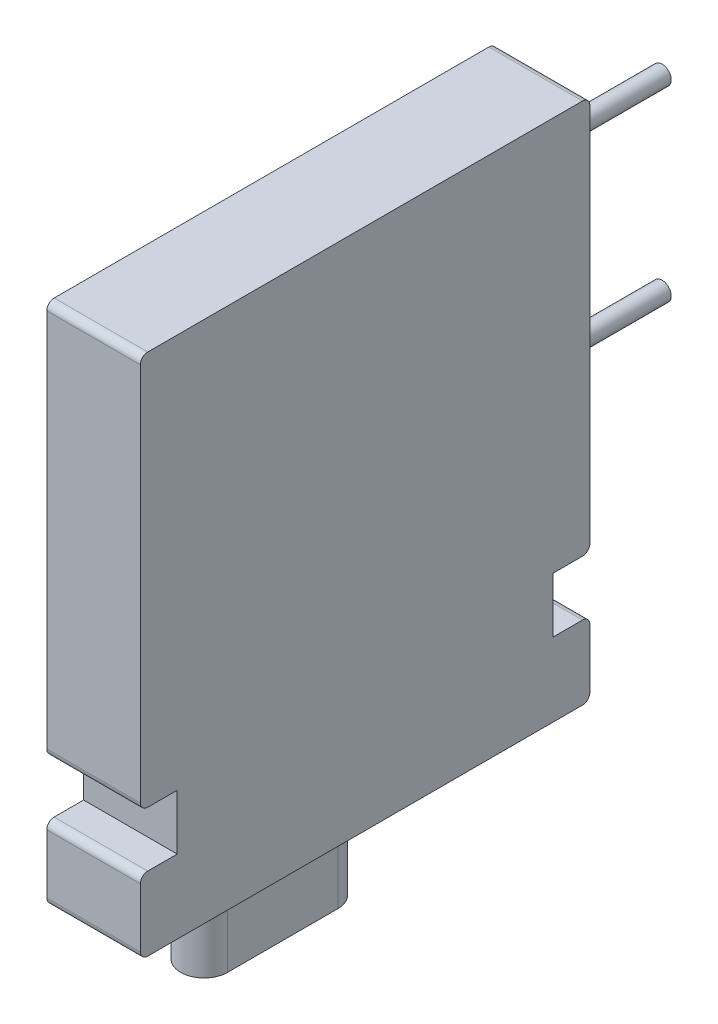
ISO-10303-21;
HEADER;
FILE_DESCRIPTION(('STEP AP214'),'2;1');
FILE_NAME('part.step','',(''),(''),'','','');
FILE_SCHEMA(('AUTOMOTIVE_DESIGN { 1 0 10303 214 1 1 1 1 }'));
ENDSEC;
DATA;
#1=APPLICATION_CONTEXT('core data for automotive mechanical design processes');
#2=APPLICATION_PROTOCOL_DEFINITION('international standard','automotive_design',2000,#1);
#3=PRODUCT_CONTEXT('',#1,'mechanical');
#4=PRODUCT('Part','Part','',(#3));
#5=PRODUCT_RELATED_PRODUCT_CATEGORY('part','',(#4));
#6=PRODUCT_DEFINITION_FORMATION('','',#4);
#7=PRODUCT_DEFINITION_CONTEXT('part definition',#1,'design');
#8=PRODUCT_DEFINITION('design','',#6,#7);
#9=PRODUCT_DEFINITION_SHAPE('','',#8);
#10=(LENGTH_UNIT() NAMED_UNIT(*) SI_UNIT(.MILLI.,.METRE.));
#11=(NAMED_UNIT(*) PLANE_ANGLE_UNIT() SI_UNIT($,.RADIAN.));
#12=(NAMED_UNIT(*) SI_UNIT($,.STERADIAN.) SOLID_ANGLE_UNIT());
#13=UNCERTAINTY_MEASURE_WITH_UNIT(LENGTH_MEASURE(1.E-05),#10,'distance_accuracy_value','');
#14=(GEOMETRIC_REPRESENTATION_CONTEXT(3) GLOBAL_UNCERTAINTY_ASSIGNED_CONTEXT((#13)) GLOBAL_UNIT_ASSIGNED_CONTEXT((#10,
#11,#12)) REPRESENTATION_CONTEXT('',''));
#15=CARTESIAN_POINT('',(0.,0.,0.));
#16=DIRECTION('',(0.,0.,1.));
#17=DIRECTION('',(1.,0.,0.));
#18=AXIS2_PLACEMENT_3D('',#15,#16,#17);
#19=CARTESIAN_POINT('',(0.,0.,0.));
#20=DIRECTION('',(0.,0.,-1.));
#21=DIRECTION('',(-1.,0.,0.));
#22=AXIS2_PLACEMENT_3D('',#19,#20,#21);
#23=PLANE('',#22);
#24=DIRECTION('',(0.,1.,0.));
#25=VECTOR('',#24,1.);
#26=CARTESIAN_POINT('',(2.54,0.,0.));
#27=LINE('',#26,#25);
#28=CARTESIAN_POINT('',(2.54,3.7,0.));
#29=VERTEX_POINT('',#28);
#30=CARTESIAN_POINT('',(2.54,14.,0.));
#31=VERTEX_POINT('',#30);
#32=EDGE_CURVE('E368',#29,#31,#27,.T.);
#33=ORIENTED_EDGE('',*,*,#32,.F.);
#34=DIRECTION('',(-1.,0.,0.));
#35=VECTOR('',#34,1.);
#36=CARTESIAN_POINT('',(0.,3.7,0.));
#37=LINE('',#36,#35);
#38=CARTESIAN_POINT('',(0.,3.7,0.));
#39=VERTEX_POINT('',#38);
#40=EDGE_CURVE('E382',#29,#39,#37,.T.);
#41=ORIENTED_EDGE('',*,*,#40,.T.);
#42=DIRECTION('',(0.,-1.,0.));
#43=VECTOR('',#42,1.);
#44=CARTESIAN_POINT('',(0.,0.,0.));
#45=LINE('',#44,#43);
#46=CARTESIAN_POINT('',(0.,14.,0.));
#47=VERTEX_POINT('',#46);
#48=EDGE_CURVE('E365',#47,#39,#45,.T.);
#49=ORIENTED_EDGE('',*,*,#48,.F.);
#50=DIRECTION('',(-1.,0.,0.));
#51=VECTOR('',#50,1.);
#52=CARTESIAN_POINT('',(2.54,14.,0.));
#53=LINE('',#52,#51);
#54=EDGE_CURVE('E380',#47,#31,#53,.F.);
#55=ORIENTED_EDGE('',*,*,#54,.T.);
#56=EDGE_LOOP('',(#33,#41,#49,#55));
#57=FACE_BOUND('',#56,.T.);
#58=CARTESIAN_POINT('',(1.5,7.62,0.));
#59=DIRECTION('',(0.,0.,-1.));
#60=DIRECTION('',(-1.,0.,0.));
#61=AXIS2_PLACEMENT_3D('',#58,#59,#60);
#62=CIRCLE('',#61,0.25);
#63=CARTESIAN_POINT('',(1.25,7.62,0.));
#64=VERTEX_POINT('',#63);
#65=EDGE_CURVE('E341',#64,#64,#62,.T.);
#66=ORIENTED_EDGE('',*,*,#65,.F.);
#67=EDGE_LOOP('',(#66));
#68=FACE_BOUND('',#67,.T.);
#69=CARTESIAN_POINT('',(1.5,12.7,0.));
#70=DIRECTION('',(0.,0.,-1.));
#71=DIRECTION('',(-1.,0.,0.));
#72=AXIS2_PLACEMENT_3D('',#69,#70,#71);
#73=CIRCLE('',#72,0.25);
#74=CARTESIAN_POINT('',(1.25,12.7,0.));
#75=VERTEX_POINT('',#74);
#76=EDGE_CURVE('E345',#75,#75,#73,.T.);
#77=ORIENTED_EDGE('',*,*,#76,.F.);
#78=EDGE_LOOP('',(#77));
#79=FACE_BOUND('',#78,.T.);
#80=ADVANCED_FACE('F37',(#57,#68,#79),#23,.T.);
#81=CARTESIAN_POINT('',(0.,0.,12.2));
#82=DIRECTION('',(0.,0.,-1.));
#83=DIRECTION('',(-1.,0.,0.));
#84=AXIS2_PLACEMENT_3D('',#81,#82,#83);
#85=PLANE('',#84);
#86=DIRECTION('',(0.,-1.,0.));
#87=VECTOR('',#86,1.);
#88=CARTESIAN_POINT('',(0.,0.,12.2));
#89=LINE('',#88,#87);
#90=CARTESIAN_POINT('',(0.,14.,12.2));
#91=VERTEX_POINT('',#90);
#92=CARTESIAN_POINT('',(0.,3.7,12.2));
#93=VERTEX_POINT('',#92);
#94=EDGE_CURVE('E354',#91,#93,#89,.T.);
#95=ORIENTED_EDGE('',*,*,#94,.T.);
#96=DIRECTION('',(-1.,0.,0.));
#97=VECTOR('',#96,1.);
#98=CARTESIAN_POINT('',(0.,3.7,12.2));
#99=LINE('',#98,#97);
#100=CARTESIAN_POINT('',(2.54,3.7,12.2));
#101=VERTEX_POINT('',#100);
#102=EDGE_CURVE('E429',#93,#101,#99,.F.);
#103=ORIENTED_EDGE('',*,*,#102,.T.);
#104=DIRECTION('',(0.,1.,0.));
#105=VECTOR('',#104,1.);
#106=CARTESIAN_POINT('',(2.54,0.,12.2));
#107=LINE('',#106,#105);
#108=CARTESIAN_POINT('',(2.54,14.,12.2));
#109=VERTEX_POINT('',#108);
#110=EDGE_CURVE('E357',#101,#109,#107,.T.);
#111=ORIENTED_EDGE('',*,*,#110,.T.);
#112=DIRECTION('',(-1.,0.,0.));
#113=VECTOR('',#112,1.);
#114=CARTESIAN_POINT('',(0.,14.,12.2));
#115=LINE('',#114,#113);
#116=EDGE_CURVE('E426',#109,#91,#115,.T.);
#117=ORIENTED_EDGE('',*,*,#116,.T.);
#118=EDGE_LOOP('',(#95,#103,#111,#117));
#119=FACE_BOUND('',#118,.T.);
#120=ADVANCED_FACE('F486',(#119),#85,.F.);
#121=CARTESIAN_POINT('',(0.,0.,12.2));
#122=DIRECTION('',(0.,1.,0.));
#123=DIRECTION('',(0.,0.,1.));
#124=AXIS2_PLACEMENT_3D('',#121,#122,#123);
#125=PLANE('',#124);
#126=DIRECTION('',(-1.,0.,0.));
#127=VECTOR('',#126,1.);
#128=CARTESIAN_POINT('',(0.269999999999998,0.,3.5));
#129=LINE('',#128,#127);
#130=CARTESIAN_POINT('',(2.27,0.,3.5));
#131=VERTEX_POINT('',#130);
#132=CARTESIAN_POINT('',(0.269999999999998,0.,3.5));
#133=VERTEX_POINT('',#132);
#134=EDGE_CURVE('E292',#131,#133,#129,.T.);
#135=ORIENTED_EDGE('',*,*,#134,.F.);
#136=DIRECTION('',(0.,0.,1.));
#137=VECTOR('',#136,1.);
#138=CARTESIAN_POINT('',(2.27,0.,3.5));
#139=LINE('',#138,#137);
#140=CARTESIAN_POINT('',(2.27,0.,1.5));
#141=VERTEX_POINT('',#140);
#142=EDGE_CURVE('E276',#141,#131,#139,.T.);
#143=ORIENTED_EDGE('',*,*,#142,.F.);
#144=DIRECTION('',(1.,0.,0.));
#145=VECTOR('',#144,1.);
#146=CARTESIAN_POINT('',(0.269999999999999,0.,1.5));
#147=LINE('',#146,#145);
#148=CARTESIAN_POINT('',(0.269999999999999,0.,1.5));
#149=VERTEX_POINT('',#148);
#150=EDGE_CURVE('E281',#149,#141,#147,.T.);
#151=ORIENTED_EDGE('',*,*,#150,.F.);
#152=DIRECTION('',(0.,0.,-1.));
#153=VECTOR('',#152,1.);
#154=CARTESIAN_POINT('',(0.269999999999998,0.,3.5));
#155=LINE('',#154,#153);
#156=EDGE_CURVE('E295',#133,#149,#155,.T.);
#157=ORIENTED_EDGE('',*,*,#156,.F.);
#158=EDGE_LOOP('',(#135,#143,#151,#157));
#159=FACE_BOUND('',#158,.T.);
#160=DIRECTION('',(0.,0.,-1.));
#161=VECTOR('',#160,1.);
#162=CARTESIAN_POINT('',(0.,0.,12.2));
#163=LINE('',#162,#161);
#164=CARTESIAN_POINT('',(0.,0.,12.));
#165=VERTEX_POINT('',#164);
#166=CARTESIAN_POINT('',(0.,0.,0.200000000000001));
#167=VERTEX_POINT('',#166);
#168=EDGE_CURVE('E377',#165,#167,#163,.T.);
#169=ORIENTED_EDGE('',*,*,#168,.T.);
#170=DIRECTION('',(1.,0.,0.));
#171=VECTOR('',#170,1.);
#172=CARTESIAN_POINT('',(2.54,0.,0.200000000000001));
#173=LINE('',#172,#171);
#174=CARTESIAN_POINT('',(2.54,0.,0.200000000000001));
#175=VERTEX_POINT('',#174);
#176=EDGE_CURVE('E11',#167,#175,#173,.T.);
#177=ORIENTED_EDGE('',*,*,#176,.T.);
#178=DIRECTION('',(0.,0.,-1.));
#179=VECTOR('',#178,1.);
#180=CARTESIAN_POINT('',(2.54,0.,12.2));
#181=LINE('',#180,#179);
#182=CARTESIAN_POINT('',(2.54,0.,12.));
#183=VERTEX_POINT('',#182);
#184=EDGE_CURVE('E374',#183,#175,#181,.T.);
#185=ORIENTED_EDGE('',*,*,#184,.F.);
#186=DIRECTION('',(1.,0.,0.));
#187=VECTOR('',#186,1.);
#188=CARTESIAN_POINT('',(0.,0.,12.));
#189=LINE('',#188,#187);
#190=EDGE_CURVE('E45',#183,#165,#189,.F.);
#191=ORIENTED_EDGE('',*,*,#190,.T.);
#192=EDGE_LOOP('',(#169,#177,#185,#191));
#193=FACE_BOUND('',#192,.T.);
#194=CARTESIAN_POINT('',(1.27,0.,9.2));
#195=DIRECTION('',(0.,-1.,0.));
#196=DIRECTION('',(0.,0.,-1.));
#197=AXIS2_PLACEMENT_3D('',#194,#195,#196);
#198=CIRCLE('',#197,0.635);
#199=CARTESIAN_POINT('',(1.905,0.,9.2));
#200=VERTEX_POINT('',#199);
#201=CARTESIAN_POINT('',(0.635,0.,9.2));
#202=VERTEX_POINT('',#201);
#203=EDGE_CURVE('E302',#200,#202,#198,.T.);
#204=ORIENTED_EDGE('',*,*,#203,.F.);
#205=DIRECTION('',(0.,0.,1.));
#206=VECTOR('',#205,1.);
#207=CARTESIAN_POINT('',(1.905,0.,9.2));
#208=LINE('',#207,#206);
#209=CARTESIAN_POINT('',(1.905,0.,6.2));
#210=VERTEX_POINT('',#209);
#211=EDGE_CURVE('E313',#210,#200,#208,.T.);
#212=ORIENTED_EDGE('',*,*,#211,.F.);
#213=CARTESIAN_POINT('',(1.27,0.,6.2));
#214=DIRECTION('',(0.,-1.,0.));
#215=DIRECTION('',(0.,0.,-1.));
#216=AXIS2_PLACEMENT_3D('',#213,#214,#215);
#217=CIRCLE('',#216,0.635);
#218=CARTESIAN_POINT('',(0.635,0.,6.2));
#219=VERTEX_POINT('',#218);
#220=EDGE_CURVE('E325',#219,#210,#217,.T.);
#221=ORIENTED_EDGE('',*,*,#220,.F.);
#222=DIRECTION('',(0.,0.,-1.));
#223=VECTOR('',#222,1.);
#224=CARTESIAN_POINT('',(0.635,0.,9.2));
#225=LINE('',#224,#223);
#226=EDGE_CURVE('E322',#202,#219,#225,.T.);
#227=ORIENTED_EDGE('',*,*,#226,.F.);
#228=EDGE_LOOP('',(#204,#212,#221,#227));
#229=FACE_BOUND('',#228,.T.);
#230=ADVANCED_FACE('F447',(#159,#193,#229),#125,.F.);
#231=CARTESIAN_POINT('',(0.,0.,12.2));
#232=DIRECTION('',(1.,0.,0.));
#233=DIRECTION('',(0.,0.,-1.));
#234=AXIS2_PLACEMENT_3D('',#231,#232,#233);
#235=PLANE('',#234);
#236=ORIENTED_EDGE('',*,*,#48,.T.);
#237=CARTESIAN_POINT('',(0.,3.7,0.2));
#238=DIRECTION('',(1.,0.,0.));
#239=DIRECTION('',(0.,0.,-1.));
#240=AXIS2_PLACEMENT_3D('',#237,#238,#239);
#241=CIRCLE('',#240,0.2);
#242=CARTESIAN_POINT('',(0.,3.5,0.2));
#243=VERTEX_POINT('',#242);
#244=EDGE_CURVE('E399',#39,#243,#241,.F.);
#245=ORIENTED_EDGE('',*,*,#244,.T.);
#246=DIRECTION('',(0.,0.,-1.));
#247=VECTOR('',#246,1.);
#248=CARTESIAN_POINT('',(0.,3.5,1.));
#249=LINE('',#248,#247);
#250=CARTESIAN_POINT('',(0.,3.5,1.));
#251=VERTEX_POINT('',#250);
#252=EDGE_CURVE('E247',#251,#243,#249,.T.);
#253=ORIENTED_EDGE('',*,*,#252,.F.);
#254=DIRECTION('',(0.,1.,0.));
#255=VECTOR('',#254,1.);
#256=CARTESIAN_POINT('',(0.,3.5,1.));
#257=LINE('',#256,#255);
#258=CARTESIAN_POINT('',(0.,2.,1.));
#259=VERTEX_POINT('',#258);
#260=EDGE_CURVE('E237',#259,#251,#257,.T.);
#261=ORIENTED_EDGE('',*,*,#260,.F.);
#262=DIRECTION('',(0.,0.,1.));
#263=VECTOR('',#262,1.);
#264=CARTESIAN_POINT('',(0.,2.,1.));
#265=LINE('',#264,#263);
#266=CARTESIAN_POINT('',(0.,2.,0.2));
#267=VERTEX_POINT('',#266);
#268=EDGE_CURVE('E222',#267,#259,#265,.T.);
#269=ORIENTED_EDGE('',*,*,#268,.F.);
#270=CARTESIAN_POINT('',(0.,1.8,0.2));
#271=DIRECTION('',(1.,0.,0.));
#272=DIRECTION('',(0.,0.,-1.));
#273=AXIS2_PLACEMENT_3D('',#270,#271,#272);
#274=CIRCLE('',#273,0.2);
#275=CARTESIAN_POINT('',(0.,1.8,0.));
#276=VERTEX_POINT('',#275);
#277=EDGE_CURVE('E397',#267,#276,#274,.F.);
#278=ORIENTED_EDGE('',*,*,#277,.T.);
#279=CARTESIAN_POINT('',(0.,0.2,0.));
#280=VERTEX_POINT('',#279);
#281=EDGE_CURVE('E351',#276,#280,#45,.T.);
#282=ORIENTED_EDGE('',*,*,#281,.T.);
#283=CARTESIAN_POINT('',(0.,0.2,0.200000000000001));
#284=DIRECTION('',(1.,0.,0.));
#285=DIRECTION('',(0.,0.,-1.));
#286=AXIS2_PLACEMENT_3D('',#283,#284,#285);
#287=CIRCLE('',#286,0.2);
#288=EDGE_CURVE('E387',#280,#167,#287,.F.);
#289=ORIENTED_EDGE('',*,*,#288,.T.);
#290=ORIENTED_EDGE('',*,*,#168,.F.);
#291=CARTESIAN_POINT('',(0.,0.2,12.));
#292=DIRECTION('',(1.,0.,0.));
#293=DIRECTION('',(0.,0.,-1.));
#294=AXIS2_PLACEMENT_3D('',#291,#292,#293);
#295=CIRCLE('',#294,0.2);
#296=CARTESIAN_POINT('',(0.,0.2,12.2));
#297=VERTEX_POINT('',#296);
#298=EDGE_CURVE('E385',#165,#297,#295,.F.);
#299=ORIENTED_EDGE('',*,*,#298,.T.);
#300=CARTESIAN_POINT('',(0.,1.8,12.2));
#301=VERTEX_POINT('',#300);
#302=EDGE_CURVE('E358',#301,#297,#89,.T.);
#303=ORIENTED_EDGE('',*,*,#302,.F.);
#304=CARTESIAN_POINT('',(0.,1.8,12.));
#305=DIRECTION('',(1.,0.,0.));
#306=DIRECTION('',(0.,0.,-1.));
#307=AXIS2_PLACEMENT_3D('',#304,#305,#306);
#308=CIRCLE('',#307,0.2);
#309=CARTESIAN_POINT('',(0.,2.,12.));
#310=VERTEX_POINT('',#309);
#311=EDGE_CURVE('E393',#301,#310,#308,.F.);
#312=ORIENTED_EDGE('',*,*,#311,.T.);
#313=DIRECTION('',(0.,0.,1.));
#314=VECTOR('',#313,1.);
#315=CARTESIAN_POINT('',(0.,2.,13.7974919074563));
#316=LINE('',#315,#314);
#317=CARTESIAN_POINT('',(0.,2.,11.2));
#318=VERTEX_POINT('',#317);
#319=EDGE_CURVE('E271',#318,#310,#316,.T.);
#320=ORIENTED_EDGE('',*,*,#319,.F.);
#321=DIRECTION('',(0.,-1.,0.));
#322=VECTOR('',#321,1.);
#323=CARTESIAN_POINT('',(0.,3.5,11.2));
#324=LINE('',#323,#322);
#325=CARTESIAN_POINT('',(0.,3.5,11.2));
#326=VERTEX_POINT('',#325);
#327=EDGE_CURVE('E231',#326,#318,#324,.T.);
#328=ORIENTED_EDGE('',*,*,#327,.F.);
#329=DIRECTION('',(0.,0.,-1.));
#330=VECTOR('',#329,1.);
#331=CARTESIAN_POINT('',(0.,3.5,13.7974919074563));
#332=LINE('',#331,#330);
#333=CARTESIAN_POINT('',(0.,3.5,12.));
#334=VERTEX_POINT('',#333);
#335=EDGE_CURVE('E258',#334,#326,#332,.T.);
#336=ORIENTED_EDGE('',*,*,#335,.F.);
#337=CARTESIAN_POINT('',(0.,3.7,12.));
#338=DIRECTION('',(1.,0.,0.));
#339=DIRECTION('',(0.,0.,-1.));
#340=AXIS2_PLACEMENT_3D('',#337,#338,#339);
#341=CIRCLE('',#340,0.2);
#342=EDGE_CURVE('E395',#334,#93,#341,.F.);
#343=ORIENTED_EDGE('',*,*,#342,.T.);
#344=ORIENTED_EDGE('',*,*,#94,.F.);
#345=CARTESIAN_POINT('',(0.,14.,12.));
#346=DIRECTION('',(1.,0.,0.));
#347=DIRECTION('',(0.,0.,-1.));
#348=AXIS2_PLACEMENT_3D('',#345,#346,#347);
#349=CIRCLE('',#348,0.2);
#350=CARTESIAN_POINT('',(0.,14.2,12.));
#351=VERTEX_POINT('',#350);
#352=EDGE_CURVE('E389',#91,#351,#349,.F.);
#353=ORIENTED_EDGE('',*,*,#352,.T.);
#354=DIRECTION('',(0.,0.,-1.));
#355=VECTOR('',#354,1.);
#356=CARTESIAN_POINT('',(0.,14.2,12.2));
#357=LINE('',#356,#355);
#358=CARTESIAN_POINT('',(0.,14.2,0.200000000000001));
#359=VERTEX_POINT('',#358);
#360=EDGE_CURVE('E362',#351,#359,#357,.T.);
#361=ORIENTED_EDGE('',*,*,#360,.T.);
#362=CARTESIAN_POINT('',(0.,14.,0.200000000000001));
#363=DIRECTION('',(1.,0.,0.));
#364=DIRECTION('',(0.,0.,-1.));
#365=AXIS2_PLACEMENT_3D('',#362,#363,#364);
#366=CIRCLE('',#365,0.2);
#367=EDGE_CURVE('E391',#359,#47,#366,.F.);
#368=ORIENTED_EDGE('',*,*,#367,.T.);
#369=EDGE_LOOP('',(#236,#245,#253,#261,#269,#278,#282,#289,#290,#299,#303,#312,#320,#328,#336,
#343,#344,#353,#361,#368));
#370=FACE_BOUND('',#369,.T.);
#371=ADVANCED_FACE('F245',(#370),#235,.F.);
#372=CARTESIAN_POINT('',(2.54,0.,12.2));
#373=DIRECTION('',(-1.,0.,0.));
#374=DIRECTION('',(0.,0.,1.));
#375=AXIS2_PLACEMENT_3D('',#372,#373,#374);
#376=PLANE('',#375);
#377=DIRECTION('',(0.,0.,1.));
#378=VECTOR('',#377,1.);
#379=CARTESIAN_POINT('',(2.54,3.5,1.));
#380=LINE('',#379,#378);
#381=CARTESIAN_POINT('',(2.54,3.5,0.2));
#382=VERTEX_POINT('',#381);
#383=CARTESIAN_POINT('',(2.54,3.5,1.));
#384=VERTEX_POINT('',#383);
#385=EDGE_CURVE('E241',#382,#384,#380,.T.);
#386=ORIENTED_EDGE('',*,*,#385,.F.);
#387=CARTESIAN_POINT('',(2.54,3.7,0.2));
#388=DIRECTION('',(-1.,0.,0.));
#389=DIRECTION('',(0.,0.,1.));
#390=AXIS2_PLACEMENT_3D('',#387,#388,#389);
#391=CIRCLE('',#390,0.2);
#392=EDGE_CURVE('E416',#382,#29,#391,.F.);
#393=ORIENTED_EDGE('',*,*,#392,.T.);
#394=ORIENTED_EDGE('',*,*,#32,.T.);
#395=CARTESIAN_POINT('',(2.54,14.,0.200000000000001));
#396=DIRECTION('',(-1.,0.,0.));
#397=DIRECTION('',(0.,0.,1.));
#398=AXIS2_PLACEMENT_3D('',#395,#396,#397);
#399=CIRCLE('',#398,0.2);
#400=CARTESIAN_POINT('',(2.54,14.2,0.200000000000001));
#401=VERTEX_POINT('',#400);
#402=EDGE_CURVE('E409',#31,#401,#399,.F.);
#403=ORIENTED_EDGE('',*,*,#402,.T.);
#404=DIRECTION('',(0.,0.,-1.));
#405=VECTOR('',#404,1.);
#406=CARTESIAN_POINT('',(2.54,14.2,12.2));
#407=LINE('',#406,#405);
#408=CARTESIAN_POINT('',(2.54,14.2,12.));
#409=VERTEX_POINT('',#408);
#410=EDGE_CURVE('E371',#409,#401,#407,.T.);
#411=ORIENTED_EDGE('',*,*,#410,.F.);
#412=CARTESIAN_POINT('',(2.54,14.,12.));
#413=DIRECTION('',(-1.,0.,0.));
#414=DIRECTION('',(0.,0.,1.));
#415=AXIS2_PLACEMENT_3D('',#412,#413,#414);
#416=CIRCLE('',#415,0.2);
#417=EDGE_CURVE('E407',#409,#109,#416,.F.);
#418=ORIENTED_EDGE('',*,*,#417,.T.);
#419=ORIENTED_EDGE('',*,*,#110,.F.);
#420=CARTESIAN_POINT('',(2.54,3.7,12.));
#421=DIRECTION('',(-1.,0.,0.));
#422=DIRECTION('',(0.,0.,1.));
#423=AXIS2_PLACEMENT_3D('',#420,#421,#422);
#424=CIRCLE('',#423,0.2);
#425=CARTESIAN_POINT('',(2.54,3.5,12.));
#426=VERTEX_POINT('',#425);
#427=EDGE_CURVE('E413',#101,#426,#424,.F.);
#428=ORIENTED_EDGE('',*,*,#427,.T.);
#429=DIRECTION('',(0.,0.,1.));
#430=VECTOR('',#429,1.);
#431=CARTESIAN_POINT('',(2.54,3.5,13.7974919074563));
#432=LINE('',#431,#430);
#433=CARTESIAN_POINT('',(2.54,3.5,11.2));
#434=VERTEX_POINT('',#433);
#435=EDGE_CURVE('E265',#434,#426,#432,.T.);
#436=ORIENTED_EDGE('',*,*,#435,.F.);
#437=DIRECTION('',(0.,1.,0.));
#438=VECTOR('',#437,1.);
#439=CARTESIAN_POINT('',(2.54,3.5,11.2));
#440=LINE('',#439,#438);
#441=CARTESIAN_POINT('',(2.54,2.,11.2));
#442=VERTEX_POINT('',#441);
#443=EDGE_CURVE('E262',#442,#434,#440,.T.);
#444=ORIENTED_EDGE('',*,*,#443,.F.);
#445=DIRECTION('',(0.,0.,-1.));
#446=VECTOR('',#445,1.);
#447=CARTESIAN_POINT('',(2.54,2.,13.7974919074563));
#448=LINE('',#447,#446);
#449=CARTESIAN_POINT('',(2.54,2.,12.));
#450=VERTEX_POINT('',#449);
#451=EDGE_CURVE('E260',#450,#442,#448,.T.);
#452=ORIENTED_EDGE('',*,*,#451,.F.);
#453=CARTESIAN_POINT('',(2.54,1.8,12.));
#454=DIRECTION('',(-1.,0.,0.));
#455=DIRECTION('',(0.,0.,1.));
#456=AXIS2_PLACEMENT_3D('',#453,#454,#455);
#457=CIRCLE('',#456,0.2);
#458=CARTESIAN_POINT('',(2.54,1.8,12.2));
#459=VERTEX_POINT('',#458);
#460=EDGE_CURVE('E411',#450,#459,#457,.F.);
#461=ORIENTED_EDGE('',*,*,#460,.T.);
#462=CARTESIAN_POINT('',(2.54,0.2,12.2));
#463=VERTEX_POINT('',#462);
#464=EDGE_CURVE('E359',#463,#459,#107,.T.);
#465=ORIENTED_EDGE('',*,*,#464,.F.);
#466=CARTESIAN_POINT('',(2.54,0.2,12.));
#467=DIRECTION('',(-1.,0.,0.));
#468=DIRECTION('',(0.,0.,1.));
#469=AXIS2_PLACEMENT_3D('',#466,#467,#468);
#470=CIRCLE('',#469,0.2);
#471=EDGE_CURVE('E403',#463,#183,#470,.F.);
#472=ORIENTED_EDGE('',*,*,#471,.T.);
#473=ORIENTED_EDGE('',*,*,#184,.T.);
#474=CARTESIAN_POINT('',(2.54,0.2,0.200000000000001));
#475=DIRECTION('',(-1.,0.,0.));
#476=DIRECTION('',(0.,0.,1.));
#477=AXIS2_PLACEMENT_3D('',#474,#475,#476);
#478=CIRCLE('',#477,0.2);
#479=CARTESIAN_POINT('',(2.54,0.2,0.));
#480=VERTEX_POINT('',#479);
#481=EDGE_CURVE('E405',#175,#480,#478,.F.);
#482=ORIENTED_EDGE('',*,*,#481,.T.);
#483=CARTESIAN_POINT('',(2.54,1.8,0.));
#484=VERTEX_POINT('',#483);
#485=EDGE_CURVE('E366',#480,#484,#27,.T.);
#486=ORIENTED_EDGE('',*,*,#485,.T.);
#487=CARTESIAN_POINT('',(2.54,1.8,0.2));
#488=DIRECTION('',(-1.,0.,0.));
#489=DIRECTION('',(0.,0.,1.));
#490=AXIS2_PLACEMENT_3D('',#487,#488,#489);
#491=CIRCLE('',#490,0.2);
#492=CARTESIAN_POINT('',(2.54,2.,0.2));
#493=VERTEX_POINT('',#492);
#494=EDGE_CURVE('E52',#484,#493,#491,.F.);
#495=ORIENTED_EDGE('',*,*,#494,.T.);
#496=DIRECTION('',(0.,0.,-1.));
#497=VECTOR('',#496,1.);
#498=CARTESIAN_POINT('',(2.54,2.,1.));
#499=LINE('',#498,#497);
#500=CARTESIAN_POINT('',(2.54,2.,1.));
#501=VERTEX_POINT('',#500);
#502=EDGE_CURVE('E252',#501,#493,#499,.T.);
#503=ORIENTED_EDGE('',*,*,#502,.F.);
#504=DIRECTION('',(0.,-1.,0.));
#505=VECTOR('',#504,1.);
#506=CARTESIAN_POINT('',(2.54,3.5,1.));
#507=LINE('',#506,#505);
#508=EDGE_CURVE('E240',#384,#501,#507,.T.);
#509=ORIENTED_EDGE('',*,*,#508,.F.);
#510=EDGE_LOOP('',(#386,#393,#394,#403,#411,#418,#419,#428,#436,#444,#452,#461,#465,#472,#473,
#482,#486,#495,#503,#509));
#511=FACE_BOUND('',#510,.T.);
#512=ADVANCED_FACE('F461',(#511),#376,.F.);
#513=CARTESIAN_POINT('',(0.,14.2,12.2));
#514=DIRECTION('',(0.,-1.,0.));
#515=DIRECTION('',(0.,0.,-1.));
#516=AXIS2_PLACEMENT_3D('',#513,#514,#515);
#517=PLANE('',#516);
#518=ORIENTED_EDGE('',*,*,#410,.T.);
#519=DIRECTION('',(-1.,0.,0.));
#520=VECTOR('',#519,1.);
#521=CARTESIAN_POINT('',(0.,14.2,0.200000000000001));
#522=LINE('',#521,#520);
#523=EDGE_CURVE('E441',#401,#359,#522,.T.);
#524=ORIENTED_EDGE('',*,*,#523,.T.);
#525=ORIENTED_EDGE('',*,*,#360,.F.);
#526=DIRECTION('',(-1.,0.,0.));
#527=VECTOR('',#526,1.);
#528=CARTESIAN_POINT('',(0.,14.2,12.));
#529=LINE('',#528,#527);
#530=EDGE_CURVE('E439',#351,#409,#529,.F.);
#531=ORIENTED_EDGE('',*,*,#530,.T.);
#532=EDGE_LOOP('',(#518,#524,#525,#531));
#533=FACE_BOUND('',#532,.T.);
#534=ADVANCED_FACE('F496',(#533),#517,.F.);
#535=ORIENTED_EDGE('',*,*,#464,.T.);
#536=DIRECTION('',(1.,0.,0.));
#537=VECTOR('',#536,1.);
#538=CARTESIAN_POINT('',(0.,1.8,12.2));
#539=LINE('',#538,#537);
#540=EDGE_CURVE('E437',#459,#301,#539,.F.);
#541=ORIENTED_EDGE('',*,*,#540,.T.);
#542=ORIENTED_EDGE('',*,*,#302,.T.);
#543=DIRECTION('',(1.,0.,0.));
#544=VECTOR('',#543,1.);
#545=CARTESIAN_POINT('',(0.,0.2,12.2));
#546=LINE('',#545,#544);
#547=EDGE_CURVE('E434',#297,#463,#546,.T.);
#548=ORIENTED_EDGE('',*,*,#547,.T.);
#549=EDGE_LOOP('',(#535,#541,#542,#548));
#550=FACE_BOUND('',#549,.T.);
#551=ADVANCED_FACE('F458',(#550),#85,.F.);
#552=ORIENTED_EDGE('',*,*,#281,.F.);
#553=DIRECTION('',(1.,0.,0.));
#554=VECTOR('',#553,1.);
#555=CARTESIAN_POINT('',(2.54,1.8,0.));
#556=LINE('',#555,#554);
#557=EDGE_CURVE('E420',#276,#484,#556,.T.);
#558=ORIENTED_EDGE('',*,*,#557,.T.);
#559=ORIENTED_EDGE('',*,*,#485,.F.);
#560=DIRECTION('',(1.,0.,0.));
#561=VECTOR('',#560,1.);
#562=CARTESIAN_POINT('',(0.,0.2,0.));
#563=LINE('',#562,#561);
#564=EDGE_CURVE('E418',#480,#280,#563,.F.);
#565=ORIENTED_EDGE('',*,*,#564,.T.);
#566=EDGE_LOOP('',(#552,#558,#559,#565));
#567=FACE_BOUND('',#566,.T.);
#568=ADVANCED_FACE('F518',(#567),#23,.T.);
#569=CARTESIAN_POINT('',(1.5,12.7,-3.));
#570=DIRECTION('',(0.,0.,1.));
#571=DIRECTION('',(1.,0.,0.));
#572=AXIS2_PLACEMENT_3D('',#569,#570,#571);
#573=CYLINDRICAL_SURFACE('',#572,0.25);
#574=CARTESIAN_POINT('',(1.5,12.7,-3.));
#575=DIRECTION('',(0.,0.,-1.));
#576=DIRECTION('',(-1.,0.,0.));
#577=AXIS2_PLACEMENT_3D('',#574,#575,#576);
#578=CIRCLE('',#577,0.25);
#579=CARTESIAN_POINT('',(1.25,12.7,-3.));
#580=VERTEX_POINT('',#579);
#581=EDGE_CURVE('E348',#580,#580,#578,.T.);
#582=ORIENTED_EDGE('',*,*,#581,.F.);
#583=EDGE_LOOP('',(#582));
#584=FACE_BOUND('',#583,.T.);
#585=ORIENTED_EDGE('',*,*,#76,.T.);
#586=EDGE_LOOP('',(#585));
#587=FACE_BOUND('',#586,.T.);
#588=ADVANCED_FACE('F538',(#584,#587),#573,.T.);
#589=CARTESIAN_POINT('',(1.5,12.7,-3.));
#590=DIRECTION('',(0.,0.,-1.));
#591=DIRECTION('',(-1.,0.,0.));
#592=AXIS2_PLACEMENT_3D('',#589,#590,#591);
#593=PLANE('',#592);
#594=ORIENTED_EDGE('',*,*,#581,.T.);
#595=EDGE_LOOP('',(#594));
#596=FACE_BOUND('',#595,.T.);
#597=ADVANCED_FACE('F544',(#596),#593,.T.);
#598=CARTESIAN_POINT('',(1.5,7.62,-3.));
#599=DIRECTION('',(0.,0.,1.));
#600=DIRECTION('',(1.,0.,0.));
#601=AXIS2_PLACEMENT_3D('',#598,#599,#600);
#602=CYLINDRICAL_SURFACE('',#601,0.25);
#603=CARTESIAN_POINT('',(1.5,7.62,-3.));
#604=DIRECTION('',(0.,0.,-1.));
#605=DIRECTION('',(-1.,0.,0.));
#606=AXIS2_PLACEMENT_3D('',#603,#604,#605);
#607=CIRCLE('',#606,0.25);
#608=CARTESIAN_POINT('',(1.25,7.62,-3.));
#609=VERTEX_POINT('',#608);
#610=EDGE_CURVE('E342',#609,#609,#607,.T.);
#611=ORIENTED_EDGE('',*,*,#610,.F.);
#612=EDGE_LOOP('',(#611));
#613=FACE_BOUND('',#612,.T.);
#614=ORIENTED_EDGE('',*,*,#65,.T.);
#615=EDGE_LOOP('',(#614));
#616=FACE_BOUND('',#615,.T.);
#617=ADVANCED_FACE('F553',(#613,#616),#602,.T.);
#618=CARTESIAN_POINT('',(1.5,7.62,-3.));
#619=DIRECTION('',(0.,0.,-1.));
#620=DIRECTION('',(-1.,0.,0.));
#621=AXIS2_PLACEMENT_3D('',#618,#619,#620);
#622=PLANE('',#621);
#623=ORIENTED_EDGE('',*,*,#610,.T.);
#624=EDGE_LOOP('',(#623));
#625=FACE_BOUND('',#624,.T.);
#626=ADVANCED_FACE('F557',(#625),#622,.T.);
#627=CARTESIAN_POINT('',(1.27,-2.1,9.2));
#628=DIRECTION('',(0.,1.,0.));
#629=DIRECTION('',(0.,0.,1.));
#630=AXIS2_PLACEMENT_3D('',#627,#628,#629);
#631=CYLINDRICAL_SURFACE('',#630,0.635);
#632=ORIENTED_EDGE('',*,*,#203,.T.);
#633=DIRECTION('',(0.,1.,0.));
#634=VECTOR('',#633,1.);
#635=CARTESIAN_POINT('',(0.635,-2.1,9.2));
#636=LINE('',#635,#634);
#637=CARTESIAN_POINT('',(0.635,-2.1,9.2));
#638=VERTEX_POINT('',#637);
#639=EDGE_CURVE('E338',#638,#202,#636,.T.);
#640=ORIENTED_EDGE('',*,*,#639,.F.);
#641=CARTESIAN_POINT('',(1.27,-2.1,9.2));
#642=DIRECTION('',(0.,-1.,0.));
#643=DIRECTION('',(0.,0.,-1.));
#644=AXIS2_PLACEMENT_3D('',#641,#642,#643);
#645=CIRCLE('',#644,0.635);
#646=CARTESIAN_POINT('',(1.905,-2.1,9.2));
#647=VERTEX_POINT('',#646);
#648=EDGE_CURVE('E309',#647,#638,#645,.T.);
#649=ORIENTED_EDGE('',*,*,#648,.F.);
#650=DIRECTION('',(0.,1.,0.));
#651=VECTOR('',#650,1.);
#652=CARTESIAN_POINT('',(1.905,-2.1,9.2));
#653=LINE('',#652,#651);
#654=EDGE_CURVE('E319',#647,#200,#653,.T.);
#655=ORIENTED_EDGE('',*,*,#654,.T.);
#656=EDGE_LOOP('',(#632,#640,#649,#655));
#657=FACE_BOUND('',#656,.T.);
#658=ADVANCED_FACE('F561',(#657),#631,.T.);
#659=CARTESIAN_POINT('',(0.635,-2.1,9.2));
#660=DIRECTION('',(1.,0.,0.));
#661=DIRECTION('',(0.,0.,-1.));
#662=AXIS2_PLACEMENT_3D('',#659,#660,#661);
#663=PLANE('',#662);
#664=ORIENTED_EDGE('',*,*,#226,.T.);
#665=DIRECTION('',(0.,1.,0.));
#666=VECTOR('',#665,1.);
#667=CARTESIAN_POINT('',(0.635,-2.1,6.2));
#668=LINE('',#667,#666);
#669=CARTESIAN_POINT('',(0.635,-2.1,6.2));
#670=VERTEX_POINT('',#669);
#671=EDGE_CURVE('E335',#670,#219,#668,.T.);
#672=ORIENTED_EDGE('',*,*,#671,.F.);
#673=DIRECTION('',(0.,0.,-1.));
#674=VECTOR('',#673,1.);
#675=CARTESIAN_POINT('',(0.635,-2.1,9.2));
#676=LINE('',#675,#674);
#677=EDGE_CURVE('E312',#638,#670,#676,.T.);
#678=ORIENTED_EDGE('',*,*,#677,.F.);
#679=ORIENTED_EDGE('',*,*,#639,.T.);
#680=EDGE_LOOP('',(#664,#672,#678,#679));
#681=FACE_BOUND('',#680,.T.);
#682=ADVANCED_FACE('F565',(#681),#663,.F.);
#683=CARTESIAN_POINT('',(1.27,-2.1,6.2));
#684=DIRECTION('',(0.,1.,0.));
#685=DIRECTION('',(0.,0.,1.));
#686=AXIS2_PLACEMENT_3D('',#683,#684,#685);
#687=CYLINDRICAL_SURFACE('',#686,0.635);
#688=ORIENTED_EDGE('',*,*,#220,.T.);
#689=DIRECTION('',(0.,1.,0.));
#690=VECTOR('',#689,1.);
#691=CARTESIAN_POINT('',(1.905,-2.1,6.2));
#692=LINE('',#691,#690);
#693=CARTESIAN_POINT('',(1.905,-2.1,6.2));
#694=VERTEX_POINT('',#693);
#695=EDGE_CURVE('E332',#694,#210,#692,.T.);
#696=ORIENTED_EDGE('',*,*,#695,.F.);
#697=CARTESIAN_POINT('',(1.27,-2.1,6.2));
#698=DIRECTION('',(0.,-1.,0.));
#699=DIRECTION('',(0.,0.,-1.));
#700=AXIS2_PLACEMENT_3D('',#697,#698,#699);
#701=CIRCLE('',#700,0.635);
#702=EDGE_CURVE('E315',#670,#694,#701,.T.);
#703=ORIENTED_EDGE('',*,*,#702,.F.);
#704=ORIENTED_EDGE('',*,*,#671,.T.);
#705=EDGE_LOOP('',(#688,#696,#703,#704));
#706=FACE_BOUND('',#705,.T.);
#707=ADVANCED_FACE('F569',(#706),#687,.T.);
#708=CARTESIAN_POINT('',(1.905,-2.1,9.2));
#709=DIRECTION('',(-1.,0.,0.));
#710=DIRECTION('',(0.,0.,1.));
#711=AXIS2_PLACEMENT_3D('',#708,#709,#710);
#712=PLANE('',#711);
#713=ORIENTED_EDGE('',*,*,#211,.T.);
#714=ORIENTED_EDGE('',*,*,#654,.F.);
#715=DIRECTION('',(0.,0.,1.));
#716=VECTOR('',#715,1.);
#717=CARTESIAN_POINT('',(1.905,-2.1,9.2));
#718=LINE('',#717,#716);
#719=EDGE_CURVE('E317',#694,#647,#718,.T.);
#720=ORIENTED_EDGE('',*,*,#719,.F.);
#721=ORIENTED_EDGE('',*,*,#695,.T.);
#722=EDGE_LOOP('',(#713,#714,#720,#721));
#723=FACE_BOUND('',#722,.T.);
#724=ADVANCED_FACE('F573',(#723),#712,.F.);
#725=CARTESIAN_POINT('',(1.27,-2.1,9.2));
#726=DIRECTION('',(0.,-1.,0.));
#727=DIRECTION('',(0.,0.,-1.));
#728=AXIS2_PLACEMENT_3D('',#725,#726,#727);
#729=PLANE('',#728);
#730=ORIENTED_EDGE('',*,*,#648,.T.);
#731=ORIENTED_EDGE('',*,*,#677,.T.);
#732=ORIENTED_EDGE('',*,*,#702,.T.);
#733=ORIENTED_EDGE('',*,*,#719,.T.);
#734=EDGE_LOOP('',(#730,#731,#732,#733));
#735=FACE_BOUND('',#734,.T.);
#736=ADVANCED_FACE('F577',(#735),#729,.T.);
#737=CARTESIAN_POINT('',(2.27,5.,3.5));
#738=DIRECTION('',(1.,0.,0.));
#739=DIRECTION('',(0.,0.,-1.));
#740=AXIS2_PLACEMENT_3D('',#737,#738,#739);
#741=PLANE('',#740);
#742=ORIENTED_EDGE('',*,*,#142,.T.);
#743=DIRECTION('',(0.,-1.,0.));
#744=VECTOR('',#743,1.);
#745=CARTESIAN_POINT('',(2.27,5.,3.5));
#746=LINE('',#745,#744);
#747=CARTESIAN_POINT('',(2.27,5.,3.5));
#748=VERTEX_POINT('',#747);
#749=EDGE_CURVE('E290',#748,#131,#746,.T.);
#750=ORIENTED_EDGE('',*,*,#749,.F.);
#751=DIRECTION('',(0.,0.,1.));
#752=VECTOR('',#751,1.);
#753=CARTESIAN_POINT('',(2.27,5.,3.5));
#754=LINE('',#753,#752);
#755=CARTESIAN_POINT('',(2.27,5.,1.5));
#756=VERTEX_POINT('',#755);
#757=EDGE_CURVE('E277',#756,#748,#754,.T.);
#758=ORIENTED_EDGE('',*,*,#757,.F.);
#759=DIRECTION('',(0.,-1.,0.));
#760=VECTOR('',#759,1.);
#761=CARTESIAN_POINT('',(2.27,5.,1.5));
#762=LINE('',#761,#760);
#763=EDGE_CURVE('E300',#756,#141,#762,.T.);
#764=ORIENTED_EDGE('',*,*,#763,.T.);
#765=EDGE_LOOP('',(#742,#750,#758,#764));
#766=FACE_BOUND('',#765,.T.);
#767=ADVANCED_FACE('F581',(#766),#741,.F.);
#768=CARTESIAN_POINT('',(0.269999999999999,5.,1.5));
#769=DIRECTION('',(0.,0.,-1.));
#770=DIRECTION('',(-1.,0.,0.));
#771=AXIS2_PLACEMENT_3D('',#768,#769,#770);
#772=PLANE('',#771);
#773=ORIENTED_EDGE('',*,*,#150,.T.);
#774=ORIENTED_EDGE('',*,*,#763,.F.);
#775=DIRECTION('',(1.,0.,0.));
#776=VECTOR('',#775,1.);
#777=CARTESIAN_POINT('',(0.269999999999999,5.,1.5));
#778=LINE('',#777,#776);
#779=CARTESIAN_POINT('',(0.269999999999999,5.,1.5));
#780=VERTEX_POINT('',#779);
#781=EDGE_CURVE('E287',#780,#756,#778,.T.);
#782=ORIENTED_EDGE('',*,*,#781,.F.);
#783=DIRECTION('',(0.,-1.,0.));
#784=VECTOR('',#783,1.);
#785=CARTESIAN_POINT('',(0.269999999999999,5.,1.5));
#786=LINE('',#785,#784);
#787=EDGE_CURVE('E303',#780,#149,#786,.T.);
#788=ORIENTED_EDGE('',*,*,#787,.T.);
#789=EDGE_LOOP('',(#773,#774,#782,#788));
#790=FACE_BOUND('',#789,.T.);
#791=ADVANCED_FACE('F585',(#790),#772,.F.);
#792=CARTESIAN_POINT('',(0.269999999999998,5.,3.5));
#793=DIRECTION('',(-1.,0.,0.));
#794=DIRECTION('',(0.,0.,1.));
#795=AXIS2_PLACEMENT_3D('',#792,#793,#794);
#796=PLANE('',#795);
#797=ORIENTED_EDGE('',*,*,#156,.T.);
#798=ORIENTED_EDGE('',*,*,#787,.F.);
#799=DIRECTION('',(0.,0.,-1.));
#800=VECTOR('',#799,1.);
#801=CARTESIAN_POINT('',(0.269999999999998,5.,3.5));
#802=LINE('',#801,#800);
#803=CARTESIAN_POINT('',(0.269999999999998,5.,3.5));
#804=VERTEX_POINT('',#803);
#805=EDGE_CURVE('E284',#804,#780,#802,.T.);
#806=ORIENTED_EDGE('',*,*,#805,.F.);
#807=DIRECTION('',(0.,-1.,0.));
#808=VECTOR('',#807,1.);
#809=CARTESIAN_POINT('',(0.269999999999998,5.,3.5));
#810=LINE('',#809,#808);
#811=EDGE_CURVE('E305',#804,#133,#810,.T.);
#812=ORIENTED_EDGE('',*,*,#811,.T.);
#813=EDGE_LOOP('',(#797,#798,#806,#812));
#814=FACE_BOUND('',#813,.T.);
#815=ADVANCED_FACE('F591',(#814),#796,.F.);
#816=CARTESIAN_POINT('',(0.269999999999998,5.,3.5));
#817=DIRECTION('',(0.,0.,1.));
#818=DIRECTION('',(1.,0.,0.));
#819=AXIS2_PLACEMENT_3D('',#816,#817,#818);
#820=PLANE('',#819);
#821=ORIENTED_EDGE('',*,*,#134,.T.);
#822=ORIENTED_EDGE('',*,*,#811,.F.);
#823=DIRECTION('',(-1.,0.,0.));
#824=VECTOR('',#823,1.);
#825=CARTESIAN_POINT('',(0.269999999999998,5.,3.5));
#826=LINE('',#825,#824);
#827=EDGE_CURVE('E280',#748,#804,#826,.T.);
#828=ORIENTED_EDGE('',*,*,#827,.F.);
#829=ORIENTED_EDGE('',*,*,#749,.T.);
#830=EDGE_LOOP('',(#821,#822,#828,#829));
#831=FACE_BOUND('',#830,.T.);
#832=ADVANCED_FACE('F587',(#831),#820,.F.);
#833=CARTESIAN_POINT('',(0.,5.,0.));
#834=DIRECTION('',(0.,-1.,0.));
#835=DIRECTION('',(0.,0.,-1.));
#836=AXIS2_PLACEMENT_3D('',#833,#834,#835);
#837=PLANE('',#836);
#838=ORIENTED_EDGE('',*,*,#757,.T.);
#839=ORIENTED_EDGE('',*,*,#827,.T.);
#840=ORIENTED_EDGE('',*,*,#805,.T.);
#841=ORIENTED_EDGE('',*,*,#781,.T.);
#842=EDGE_LOOP('',(#838,#839,#840,#841));
#843=FACE_BOUND('',#842,.T.);
#844=ADVANCED_FACE('F590',(#843),#837,.T.);
#845=CARTESIAN_POINT('',(-0.00100000000000013,3.5,13.7974919074563));
#846=DIRECTION('',(0.,1.,0.));
#847=DIRECTION('',(0.,0.,1.));
#848=AXIS2_PLACEMENT_3D('',#845,#846,#847);
#849=PLANE('',#848);
#850=ORIENTED_EDGE('',*,*,#435,.T.);
#851=DIRECTION('',(-1.,0.,0.));
#852=VECTOR('',#851,1.);
#853=CARTESIAN_POINT('',(-0.00100000000000013,3.5,12.));
#854=LINE('',#853,#852);
#855=EDGE_CURVE('E423',#426,#334,#854,.T.);
#856=ORIENTED_EDGE('',*,*,#855,.T.);
#857=ORIENTED_EDGE('',*,*,#335,.T.);
#858=DIRECTION('',(1.,0.,0.));
#859=VECTOR('',#858,1.);
#860=CARTESIAN_POINT('',(-0.00100000000000013,3.5,11.2));
#861=LINE('',#860,#859);
#862=EDGE_CURVE('E269',#326,#434,#861,.T.);
#863=ORIENTED_EDGE('',*,*,#862,.T.);
#864=EDGE_LOOP('',(#850,#856,#857,#863));
#865=FACE_BOUND('',#864,.T.);
#866=ADVANCED_FACE('F478',(#865),#849,.F.);
#867=CARTESIAN_POINT('',(-0.00100000000000013,3.5,11.2));
#868=DIRECTION('',(0.,0.,-1.));
#869=DIRECTION('',(-1.,0.,0.));
#870=AXIS2_PLACEMENT_3D('',#867,#868,#869);
#871=PLANE('',#870);
#872=ORIENTED_EDGE('',*,*,#327,.T.);
#873=DIRECTION('',(1.,0.,0.));
#874=VECTOR('',#873,1.);
#875=CARTESIAN_POINT('',(-0.00100000000000013,2.,11.2));
#876=LINE('',#875,#874);
#877=EDGE_CURVE('E268',#318,#442,#876,.T.);
#878=ORIENTED_EDGE('',*,*,#877,.T.);
#879=ORIENTED_EDGE('',*,*,#443,.T.);
#880=ORIENTED_EDGE('',*,*,#862,.F.);
#881=EDGE_LOOP('',(#872,#878,#879,#880));
#882=FACE_BOUND('',#881,.T.);
#883=ADVANCED_FACE('F475',(#882),#871,.F.);
#884=CARTESIAN_POINT('',(-0.00100000000000013,2.,13.7974919074563));
#885=DIRECTION('',(0.,-1.,0.));
#886=DIRECTION('',(0.,0.,-1.));
#887=AXIS2_PLACEMENT_3D('',#884,#885,#886);
#888=PLANE('',#887);
#889=ORIENTED_EDGE('',*,*,#319,.T.);
#890=DIRECTION('',(1.,0.,0.));
#891=VECTOR('',#890,1.);
#892=CARTESIAN_POINT('',(-0.00100000000000013,2.,12.));
#893=LINE('',#892,#891);
#894=EDGE_CURVE('E431',#310,#450,#893,.T.);
#895=ORIENTED_EDGE('',*,*,#894,.T.);
#896=ORIENTED_EDGE('',*,*,#451,.T.);
#897=ORIENTED_EDGE('',*,*,#877,.F.);
#898=EDGE_LOOP('',(#889,#895,#896,#897));
#899=FACE_BOUND('',#898,.T.);
#900=ADVANCED_FACE('F469',(#899),#888,.F.);
#901=CARTESIAN_POINT('',(-0.00100000000000013,3.5,1.));
#902=DIRECTION('',(0.,0.,1.));
#903=DIRECTION('',(0.,-1.,0.));
#904=AXIS2_PLACEMENT_3D('',#901,#902,#903);
#905=PLANE('',#904);
#906=ORIENTED_EDGE('',*,*,#260,.T.);
#907=DIRECTION('',(1.,0.,0.));
#908=VECTOR('',#907,1.);
#909=CARTESIAN_POINT('',(-0.00100000000000013,3.5,1.));
#910=LINE('',#909,#908);
#911=EDGE_CURVE('E232',#251,#384,#910,.T.);
#912=ORIENTED_EDGE('',*,*,#911,.T.);
#913=ORIENTED_EDGE('',*,*,#508,.T.);
#914=DIRECTION('',(1.,0.,0.));
#915=VECTOR('',#914,1.);
#916=CARTESIAN_POINT('',(-0.00100000000000013,2.,1.));
#917=LINE('',#916,#915);
#918=EDGE_CURVE('E225',#259,#501,#917,.T.);
#919=ORIENTED_EDGE('',*,*,#918,.F.);
#920=EDGE_LOOP('',(#906,#912,#913,#919));
#921=FACE_BOUND('',#920,.T.);
#922=ADVANCED_FACE('F235',(#921),#905,.F.);
#923=CARTESIAN_POINT('',(-0.00100000000000013,3.5,1.));
#924=DIRECTION('',(0.,1.,0.));
#925=DIRECTION('',(0.,0.,1.));
#926=AXIS2_PLACEMENT_3D('',#923,#924,#925);
#927=PLANE('',#926);
#928=ORIENTED_EDGE('',*,*,#252,.T.);
#929=DIRECTION('',(-1.,0.,0.));
#930=VECTOR('',#929,1.);
#931=CARTESIAN_POINT('',(2.54,3.5,0.2));
#932=LINE('',#931,#930);
#933=EDGE_CURVE('E401',#243,#382,#932,.F.);
#934=ORIENTED_EDGE('',*,*,#933,.T.);
#935=ORIENTED_EDGE('',*,*,#385,.T.);
#936=ORIENTED_EDGE('',*,*,#911,.F.);
#937=EDGE_LOOP('',(#928,#934,#935,#936));
#938=FACE_BOUND('',#937,.T.);
#939=ADVANCED_FACE('F514',(#938),#927,.F.);
#940=CARTESIAN_POINT('',(-0.00100000000000013,2.,1.));
#941=DIRECTION('',(0.,-1.,0.));
#942=DIRECTION('',(0.,0.,-1.));
#943=AXIS2_PLACEMENT_3D('',#940,#941,#942);
#944=PLANE('',#943);
#945=ORIENTED_EDGE('',*,*,#502,.T.);
#946=DIRECTION('',(1.,0.,0.));
#947=VECTOR('',#946,1.);
#948=CARTESIAN_POINT('',(0.,2.,0.2));
#949=LINE('',#948,#947);
#950=EDGE_CURVE('E227',#493,#267,#949,.F.);
#951=ORIENTED_EDGE('',*,*,#950,.T.);
#952=ORIENTED_EDGE('',*,*,#268,.T.);
#953=ORIENTED_EDGE('',*,*,#918,.T.);
#954=EDGE_LOOP('',(#945,#951,#952,#953));
#955=FACE_BOUND('',#954,.T.);
#956=ADVANCED_FACE('F224',(#955),#944,.F.);
#957=CARTESIAN_POINT('',(0.,3.7,0.2));
#958=DIRECTION('',(1.,0.,0.));
#959=DIRECTION('',(0.,0.,-1.));
#960=AXIS2_PLACEMENT_3D('',#957,#958,#959);
#961=CYLINDRICAL_SURFACE('',#960,0.2);
#962=ORIENTED_EDGE('',*,*,#392,.F.);
#963=ORIENTED_EDGE('',*,*,#933,.F.);
#964=ORIENTED_EDGE('',*,*,#244,.F.);
#965=ORIENTED_EDGE('',*,*,#40,.F.);
#966=EDGE_LOOP('',(#962,#963,#964,#965));
#967=FACE_BOUND('',#966,.T.);
#968=ADVANCED_FACE('F511',(#967),#961,.T.);
#969=CARTESIAN_POINT('',(0.,1.8,0.2));
#970=DIRECTION('',(-1.,0.,0.));
#971=DIRECTION('',(0.,0.,1.));
#972=AXIS2_PLACEMENT_3D('',#969,#970,#971);
#973=CYLINDRICAL_SURFACE('',#972,0.2);
#974=ORIENTED_EDGE('',*,*,#277,.F.);
#975=ORIENTED_EDGE('',*,*,#950,.F.);
#976=ORIENTED_EDGE('',*,*,#494,.F.);
#977=ORIENTED_EDGE('',*,*,#557,.F.);
#978=EDGE_LOOP('',(#974,#975,#976,#977));
#979=FACE_BOUND('',#978,.T.);
#980=ADVANCED_FACE('F515',(#979),#973,.T.);
#981=CARTESIAN_POINT('',(-0.00100000000000013,3.7,12.));
#982=DIRECTION('',(-1.,0.,0.));
#983=DIRECTION('',(0.,0.,1.));
#984=AXIS2_PLACEMENT_3D('',#981,#982,#983);
#985=CYLINDRICAL_SURFACE('',#984,0.2);
#986=ORIENTED_EDGE('',*,*,#427,.F.);
#987=ORIENTED_EDGE('',*,*,#102,.F.);
#988=ORIENTED_EDGE('',*,*,#342,.F.);
#989=ORIENTED_EDGE('',*,*,#855,.F.);
#990=EDGE_LOOP('',(#986,#987,#988,#989));
#991=FACE_BOUND('',#990,.T.);
#992=ADVANCED_FACE('F482',(#991),#985,.T.);
#993=CARTESIAN_POINT('',(-0.00100000000000013,1.8,12.));
#994=DIRECTION('',(1.,0.,0.));
#995=DIRECTION('',(0.,0.,-1.));
#996=AXIS2_PLACEMENT_3D('',#993,#994,#995);
#997=CYLINDRICAL_SURFACE('',#996,0.2);
#998=ORIENTED_EDGE('',*,*,#311,.F.);
#999=ORIENTED_EDGE('',*,*,#540,.F.);
#1000=ORIENTED_EDGE('',*,*,#460,.F.);
#1001=ORIENTED_EDGE('',*,*,#894,.F.);
#1002=EDGE_LOOP('',(#998,#999,#1000,#1001));
#1003=FACE_BOUND('',#1002,.T.);
#1004=ADVANCED_FACE('F467',(#1003),#997,.T.);
#1005=CARTESIAN_POINT('',(0.,14.,0.200000000000001));
#1006=DIRECTION('',(1.,0.,0.));
#1007=DIRECTION('',(0.,0.,-1.));
#1008=AXIS2_PLACEMENT_3D('',#1005,#1006,#1007);
#1009=CYLINDRICAL_SURFACE('',#1008,0.2);
#1010=ORIENTED_EDGE('',*,*,#402,.F.);
#1011=ORIENTED_EDGE('',*,*,#54,.F.);
#1012=ORIENTED_EDGE('',*,*,#367,.F.);
#1013=ORIENTED_EDGE('',*,*,#523,.F.);
#1014=EDGE_LOOP('',(#1010,#1011,#1012,#1013));
#1015=FACE_BOUND('',#1014,.T.);
#1016=ADVANCED_FACE('F501',(#1015),#1009,.T.);
#1017=CARTESIAN_POINT('',(0.,14.,12.));
#1018=DIRECTION('',(-1.,0.,0.));
#1019=DIRECTION('',(0.,0.,1.));
#1020=AXIS2_PLACEMENT_3D('',#1017,#1018,#1019);
#1021=CYLINDRICAL_SURFACE('',#1020,0.2);
#1022=ORIENTED_EDGE('',*,*,#417,.F.);
#1023=ORIENTED_EDGE('',*,*,#530,.F.);
#1024=ORIENTED_EDGE('',*,*,#352,.F.);
#1025=ORIENTED_EDGE('',*,*,#116,.F.);
#1026=EDGE_LOOP('',(#1022,#1023,#1024,#1025));
#1027=FACE_BOUND('',#1026,.T.);
#1028=ADVANCED_FACE('F492',(#1027),#1021,.T.);
#1029=CARTESIAN_POINT('',(0.,0.2,0.200000000000001));
#1030=DIRECTION('',(-1.,0.,0.));
#1031=DIRECTION('',(0.,0.,1.));
#1032=AXIS2_PLACEMENT_3D('',#1029,#1030,#1031);
#1033=CYLINDRICAL_SURFACE('',#1032,0.2);
#1034=ORIENTED_EDGE('',*,*,#288,.F.);
#1035=ORIENTED_EDGE('',*,*,#564,.F.);
#1036=ORIENTED_EDGE('',*,*,#481,.F.);
#1037=ORIENTED_EDGE('',*,*,#176,.F.);
#1038=EDGE_LOOP('',(#1034,#1035,#1036,#1037));
#1039=FACE_BOUND('',#1038,.T.);
#1040=ADVANCED_FACE('F522',(#1039),#1033,.T.);
#1041=CARTESIAN_POINT('',(0.,0.2,12.));
#1042=DIRECTION('',(1.,0.,0.));
#1043=DIRECTION('',(0.,0.,-1.));
#1044=AXIS2_PLACEMENT_3D('',#1041,#1042,#1043);
#1045=CYLINDRICAL_SURFACE('',#1044,0.2);
#1046=ORIENTED_EDGE('',*,*,#298,.F.);
#1047=ORIENTED_EDGE('',*,*,#190,.F.);
#1048=ORIENTED_EDGE('',*,*,#471,.F.);
#1049=ORIENTED_EDGE('',*,*,#547,.F.);
#1050=EDGE_LOOP('',(#1046,#1047,#1048,#1049));
#1051=FACE_BOUND('',#1050,.T.);
#1052=ADVANCED_FACE('F39',(#1051),#1045,.T.);
#1053=CLOSED_SHELL('',(#80,#120,#230,#371,#512,#534,#551,#568,#588,#597,#617,#626,#658,#682,
#707,#724,#736,#767,#791,#815,#832,#844,#866,#883,#900,#922,#939,#956,#968,#980,#992,#1004,
#1016,#1028,#1040,#1052));
#1054=MANIFOLD_SOLID_BREP('B2',#1053);
#1055=ADVANCED_BREP_SHAPE_REPRESENTATION('',(#18,#1054),#14);
#1056=SHAPE_DEFINITION_REPRESENTATION(#9,#1055);
ENDSEC;
END-ISO-10303-21;
